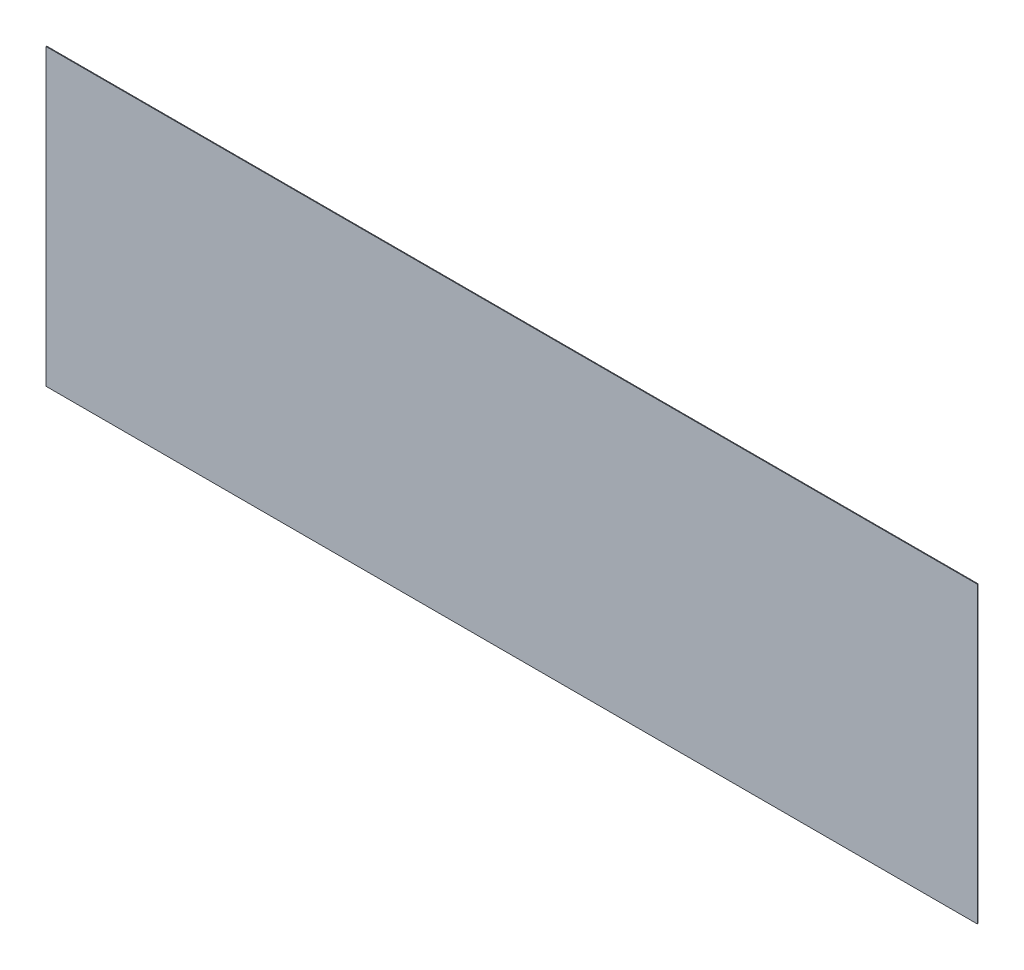
ISO-10303-21;
HEADER;
FILE_DESCRIPTION(('STEP AP214'),'2;1');
FILE_NAME('part.step','',(''),(''),'','','');
FILE_SCHEMA(('AUTOMOTIVE_DESIGN { 1 0 10303 214 1 1 1 1 }'));
ENDSEC;
DATA;
#1=APPLICATION_CONTEXT('core data for automotive mechanical design processes');
#2=APPLICATION_PROTOCOL_DEFINITION('international standard','automotive_design',2000,#1);
#3=PRODUCT_CONTEXT('',#1,'mechanical');
#4=PRODUCT('Part','Part','',(#3));
#5=PRODUCT_RELATED_PRODUCT_CATEGORY('part','',(#4));
#6=PRODUCT_DEFINITION_FORMATION('','',#4);
#7=PRODUCT_DEFINITION_CONTEXT('part definition',#1,'design');
#8=PRODUCT_DEFINITION('design','',#6,#7);
#9=PRODUCT_DEFINITION_SHAPE('','',#8);
#10=(LENGTH_UNIT() NAMED_UNIT(*) SI_UNIT(.MILLI.,.METRE.));
#11=(NAMED_UNIT(*) PLANE_ANGLE_UNIT() SI_UNIT($,.RADIAN.));
#12=(NAMED_UNIT(*) SI_UNIT($,.STERADIAN.) SOLID_ANGLE_UNIT());
#13=UNCERTAINTY_MEASURE_WITH_UNIT(LENGTH_MEASURE(1.E-05),#10,'distance_accuracy_value','');
#14=(GEOMETRIC_REPRESENTATION_CONTEXT(3) GLOBAL_UNCERTAINTY_ASSIGNED_CONTEXT((#13)) GLOBAL_UNIT_ASSIGNED_CONTEXT((#10,
#11,#12)) REPRESENTATION_CONTEXT('',''));
#15=CARTESIAN_POINT('',(0.,0.,0.));
#16=DIRECTION('',(0.,0.,1.));
#17=DIRECTION('',(1.,0.,0.));
#18=AXIS2_PLACEMENT_3D('',#15,#16,#17);
#19=CARTESIAN_POINT('',(-125.,-60.,150.2));
#20=DIRECTION('',(1.,0.,0.));
#21=DIRECTION('',(0.,1.,0.));
#22=AXIS2_PLACEMENT_3D('',#19,#20,#21);
#23=PLANE('',#22);
#24=DIRECTION('',(0.,-1.,0.));
#25=VECTOR('',#24,1.);
#26=CARTESIAN_POINT('',(-125.,-60.,150.2));
#27=LINE('',#26,#25);
#28=CARTESIAN_POINT('',(-125.,19.,150.2));
#29=VERTEX_POINT('',#28);
#30=CARTESIAN_POINT('',(-125.,-60.,150.2));
#31=VERTEX_POINT('',#30);
#32=EDGE_CURVE('E92',#29,#31,#27,.T.);
#33=ORIENTED_EDGE('',*,*,#32,.F.);
#34=DIRECTION('',(0.,0.,1.));
#35=VECTOR('',#34,1.);
#36=CARTESIAN_POINT('',(-125.,19.,140.2));
#37=LINE('',#36,#35);
#38=CARTESIAN_POINT('',(-125.,19.,150.));
#39=VERTEX_POINT('',#38);
#40=EDGE_CURVE('E99',#39,#29,#37,.T.);
#41=ORIENTED_EDGE('',*,*,#40,.F.);
#42=DIRECTION('',(0.,-1.,0.));
#43=VECTOR('',#42,1.);
#44=CARTESIAN_POINT('',(-125.,-60.,150.));
#45=LINE('',#44,#43);
#46=CARTESIAN_POINT('',(-125.,-60.,150.));
#47=VERTEX_POINT('',#46);
#48=EDGE_CURVE('E84',#39,#47,#45,.T.);
#49=ORIENTED_EDGE('',*,*,#48,.T.);
#50=DIRECTION('',(0.,0.,-1.));
#51=VECTOR('',#50,1.);
#52=CARTESIAN_POINT('',(-125.,-60.,150.2));
#53=LINE('',#52,#51);
#54=EDGE_CURVE('E46',#31,#47,#53,.T.);
#55=ORIENTED_EDGE('',*,*,#54,.F.);
#56=EDGE_LOOP('',(#33,#41,#49,#55));
#57=FACE_BOUND('',#56,.T.);
#58=ADVANCED_FACE('F39',(#57),#23,.F.);
#59=CARTESIAN_POINT('',(-125.,-60.,150.2));
#60=DIRECTION('',(0.,1.,0.));
#61=DIRECTION('',(0.,0.,1.));
#62=AXIS2_PLACEMENT_3D('',#59,#60,#61);
#63=PLANE('',#62);
#64=DIRECTION('',(1.,0.,0.));
#65=VECTOR('',#64,1.);
#66=CARTESIAN_POINT('',(-125.,-60.,150.));
#67=LINE('',#66,#65);
#68=CARTESIAN_POINT('',(125.,-60.,150.));
#69=VERTEX_POINT('',#68);
#70=EDGE_CURVE('E74',#47,#69,#67,.T.);
#71=ORIENTED_EDGE('',*,*,#70,.T.);
#72=DIRECTION('',(0.,0.,-1.));
#73=VECTOR('',#72,1.);
#74=CARTESIAN_POINT('',(125.,-60.,150.2));
#75=LINE('',#74,#73);
#76=CARTESIAN_POINT('',(125.,-60.,150.2));
#77=VERTEX_POINT('',#76);
#78=EDGE_CURVE('E77',#77,#69,#75,.T.);
#79=ORIENTED_EDGE('',*,*,#78,.F.);
#80=DIRECTION('',(1.,0.,0.));
#81=VECTOR('',#80,1.);
#82=CARTESIAN_POINT('',(-125.,-60.,150.2));
#83=LINE('',#82,#81);
#84=EDGE_CURVE('E61',#31,#77,#83,.T.);
#85=ORIENTED_EDGE('',*,*,#84,.F.);
#86=ORIENTED_EDGE('',*,*,#54,.T.);
#87=EDGE_LOOP('',(#71,#79,#85,#86));
#88=FACE_BOUND('',#87,.T.);
#89=ADVANCED_FACE('F76',(#88),#63,.F.);
#90=CARTESIAN_POINT('',(125.,-60.,150.2));
#91=DIRECTION('',(-1.,0.,0.));
#92=DIRECTION('',(0.,0.,1.));
#93=AXIS2_PLACEMENT_3D('',#90,#91,#92);
#94=PLANE('',#93);
#95=DIRECTION('',(0.,1.,0.));
#96=VECTOR('',#95,1.);
#97=CARTESIAN_POINT('',(125.,-60.,150.));
#98=LINE('',#97,#96);
#99=CARTESIAN_POINT('',(125.,19.,150.));
#100=VERTEX_POINT('',#99);
#101=EDGE_CURVE('E83',#69,#100,#98,.T.);
#102=ORIENTED_EDGE('',*,*,#101,.T.);
#103=DIRECTION('',(0.,0.,1.));
#104=VECTOR('',#103,1.);
#105=CARTESIAN_POINT('',(125.,19.,140.2));
#106=LINE('',#105,#104);
#107=CARTESIAN_POINT('',(125.,19.,150.2));
#108=VERTEX_POINT('',#107);
#109=EDGE_CURVE('E52',#100,#108,#106,.T.);
#110=ORIENTED_EDGE('',*,*,#109,.T.);
#111=DIRECTION('',(0.,1.,0.));
#112=VECTOR('',#111,1.);
#113=CARTESIAN_POINT('',(125.,-60.,150.2));
#114=LINE('',#113,#112);
#115=EDGE_CURVE('E89',#77,#108,#114,.T.);
#116=ORIENTED_EDGE('',*,*,#115,.F.);
#117=ORIENTED_EDGE('',*,*,#78,.T.);
#118=EDGE_LOOP('',(#102,#110,#116,#117));
#119=FACE_BOUND('',#118,.T.);
#120=ADVANCED_FACE('F88',(#119),#94,.F.);
#121=CARTESIAN_POINT('',(0.,0.,150.2));
#122=DIRECTION('',(0.,0.,-1.));
#123=DIRECTION('',(-1.,0.,0.));
#124=AXIS2_PLACEMENT_3D('',#121,#122,#123);
#125=PLANE('',#124);
#126=ORIENTED_EDGE('',*,*,#115,.T.);
#127=DIRECTION('',(1.,0.,0.));
#128=VECTOR('',#127,1.);
#129=CARTESIAN_POINT('',(-125.,19.,150.2));
#130=LINE('',#129,#128);
#131=EDGE_CURVE('E102',#29,#108,#130,.T.);
#132=ORIENTED_EDGE('',*,*,#131,.F.);
#133=ORIENTED_EDGE('',*,*,#32,.T.);
#134=ORIENTED_EDGE('',*,*,#84,.T.);
#135=EDGE_LOOP('',(#126,#132,#133,#134));
#136=FACE_BOUND('',#135,.T.);
#137=ADVANCED_FACE('F111',(#136),#125,.F.);
#138=CARTESIAN_POINT('',(0.,0.,150.));
#139=DIRECTION('',(0.,0.,-1.));
#140=DIRECTION('',(-1.,0.,0.));
#141=AXIS2_PLACEMENT_3D('',#138,#139,#140);
#142=PLANE('',#141);
#143=DIRECTION('',(-1.,0.,0.));
#144=VECTOR('',#143,1.);
#145=CARTESIAN_POINT('',(0.,19.,150.));
#146=LINE('',#145,#144);
#147=EDGE_CURVE('E11',#100,#39,#146,.T.);
#148=ORIENTED_EDGE('',*,*,#147,.F.);
#149=ORIENTED_EDGE('',*,*,#101,.F.);
#150=ORIENTED_EDGE('',*,*,#70,.F.);
#151=ORIENTED_EDGE('',*,*,#48,.F.);
#152=EDGE_LOOP('',(#148,#149,#150,#151));
#153=FACE_BOUND('',#152,.T.);
#154=ADVANCED_FACE('F91',(#153),#142,.T.);
#155=CARTESIAN_POINT('',(-125.,19.,140.2));
#156=DIRECTION('',(0.,-1.,0.));
#157=DIRECTION('',(0.,0.,-1.));
#158=AXIS2_PLACEMENT_3D('',#155,#156,#157);
#159=PLANE('',#158);
#160=ORIENTED_EDGE('',*,*,#147,.T.);
#161=ORIENTED_EDGE('',*,*,#40,.T.);
#162=ORIENTED_EDGE('',*,*,#131,.T.);
#163=ORIENTED_EDGE('',*,*,#109,.F.);
#164=EDGE_LOOP('',(#160,#161,#162,#163));
#165=FACE_BOUND('',#164,.T.);
#166=ADVANCED_FACE('F106',(#165),#159,.F.);
#167=CLOSED_SHELL('',(#58,#89,#120,#137,#154,#166));
#168=MANIFOLD_SOLID_BREP('B2',#167);
#169=ADVANCED_BREP_SHAPE_REPRESENTATION('',(#18,#168),#14);
#170=SHAPE_DEFINITION_REPRESENTATION(#9,#169);
ENDSEC;
END-ISO-10303-21;
